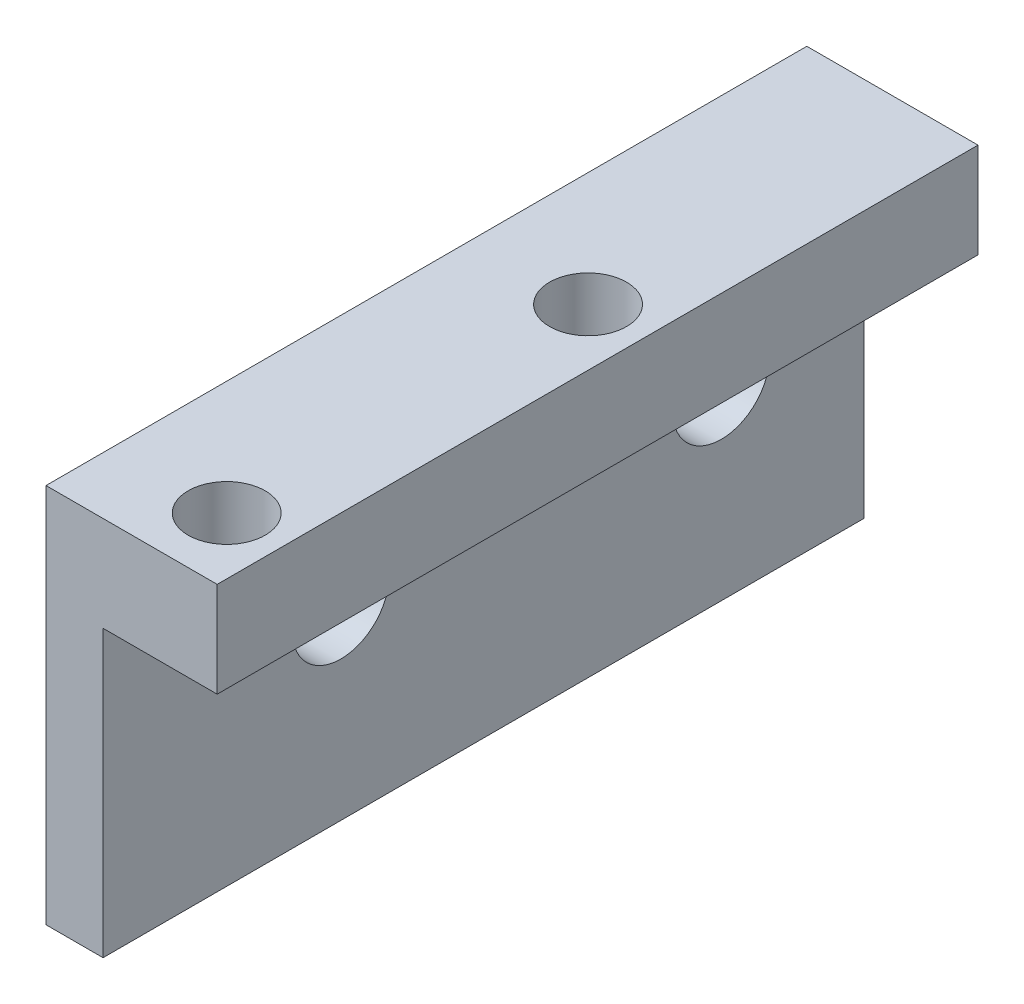
ISO-10303-21;
HEADER;
FILE_DESCRIPTION(('STEP AP214'),'2;1');
FILE_NAME('part.step','',(''),(''),'','','');
FILE_SCHEMA(('AUTOMOTIVE_DESIGN { 1 0 10303 214 1 1 1 1 }'));
ENDSEC;
DATA;
#1=APPLICATION_CONTEXT('core data for automotive mechanical design processes');
#2=APPLICATION_PROTOCOL_DEFINITION('international standard','automotive_design',2000,#1);
#3=PRODUCT_CONTEXT('',#1,'mechanical');
#4=PRODUCT('Part','Part','',(#3));
#5=PRODUCT_RELATED_PRODUCT_CATEGORY('part','',(#4));
#6=PRODUCT_DEFINITION_FORMATION('','',#4);
#7=PRODUCT_DEFINITION_CONTEXT('part definition',#1,'design');
#8=PRODUCT_DEFINITION('design','',#6,#7);
#9=PRODUCT_DEFINITION_SHAPE('','',#8);
#10=(LENGTH_UNIT() NAMED_UNIT(*) SI_UNIT(.MILLI.,.METRE.));
#11=(NAMED_UNIT(*) PLANE_ANGLE_UNIT() SI_UNIT($,.RADIAN.));
#12=(NAMED_UNIT(*) SI_UNIT($,.STERADIAN.) SOLID_ANGLE_UNIT());
#13=UNCERTAINTY_MEASURE_WITH_UNIT(LENGTH_MEASURE(1.E-05),#10,'distance_accuracy_value','');
#14=(GEOMETRIC_REPRESENTATION_CONTEXT(3) GLOBAL_UNCERTAINTY_ASSIGNED_CONTEXT((#13)) GLOBAL_UNIT_ASSIGNED_CONTEXT((#10,
#11,#12)) REPRESENTATION_CONTEXT('',''));
#15=CARTESIAN_POINT('',(0.,0.,0.));
#16=DIRECTION('',(0.,0.,1.));
#17=DIRECTION('',(1.,0.,0.));
#18=AXIS2_PLACEMENT_3D('',#15,#16,#17);
#19=CARTESIAN_POINT('',(0.,-5.,0.));
#20=DIRECTION('',(-1.,0.,0.));
#21=DIRECTION('',(0.,0.,1.));
#22=AXIS2_PLACEMENT_3D('',#19,#20,#21);
#23=PLANE('',#22);
#24=CARTESIAN_POINT('',(0.,-10.1,-32.5));
#25=DIRECTION('',(1.,0.,0.));
#26=DIRECTION('',(0.,0.,-1.));
#27=AXIS2_PLACEMENT_3D('',#24,#25,#26);
#28=CIRCLE('',#27,2.55);
#29=CARTESIAN_POINT('',(0.,-10.1,-35.05));
#30=VERTEX_POINT('',#29);
#31=EDGE_CURVE('E176',#30,#30,#28,.T.);
#32=ORIENTED_EDGE('',*,*,#31,.T.);
#33=EDGE_LOOP('',(#32));
#34=FACE_BOUND('',#33,.T.);
#35=CARTESIAN_POINT('',(0.,-10.1,-12.5));
#36=DIRECTION('',(1.,0.,0.));
#37=DIRECTION('',(0.,0.,-1.));
#38=AXIS2_PLACEMENT_3D('',#35,#36,#37);
#39=CIRCLE('',#38,2.55);
#40=CARTESIAN_POINT('',(0.,-10.1,-15.05));
#41=VERTEX_POINT('',#40);
#42=EDGE_CURVE('E129',#41,#41,#39,.T.);
#43=ORIENTED_EDGE('',*,*,#42,.T.);
#44=EDGE_LOOP('',(#43));
#45=FACE_BOUND('',#44,.T.);
#46=DIRECTION('',(0.,0.,1.));
#47=VECTOR('',#46,1.);
#48=CARTESIAN_POINT('',(0.,0.,0.));
#49=LINE('',#48,#47);
#50=CARTESIAN_POINT('',(0.,0.,-40.));
#51=VERTEX_POINT('',#50);
#52=CARTESIAN_POINT('',(0.,0.,0.));
#53=VERTEX_POINT('',#52);
#54=EDGE_CURVE('E85',#51,#53,#49,.T.);
#55=ORIENTED_EDGE('',*,*,#54,.F.);
#56=DIRECTION('',(0.,1.,0.));
#57=VECTOR('',#56,1.);
#58=CARTESIAN_POINT('',(0.,-5.,-40.));
#59=LINE('',#58,#57);
#60=CARTESIAN_POINT('',(0.,-20.,-40.));
#61=VERTEX_POINT('',#60);
#62=EDGE_CURVE('E11',#61,#51,#59,.T.);
#63=ORIENTED_EDGE('',*,*,#62,.F.);
#64=DIRECTION('',(0.,0.,-1.));
#65=VECTOR('',#64,1.);
#66=CARTESIAN_POINT('',(0.,-20.,0.));
#67=LINE('',#66,#65);
#68=CARTESIAN_POINT('',(0.,-20.,0.));
#69=VERTEX_POINT('',#68);
#70=EDGE_CURVE('E121',#69,#61,#67,.T.);
#71=ORIENTED_EDGE('',*,*,#70,.F.);
#72=DIRECTION('',(0.,1.,0.));
#73=VECTOR('',#72,1.);
#74=CARTESIAN_POINT('',(0.,-5.,0.));
#75=LINE('',#74,#73);
#76=EDGE_CURVE('E36',#69,#53,#75,.T.);
#77=ORIENTED_EDGE('',*,*,#76,.T.);
#78=EDGE_LOOP('',(#55,#63,#71,#77));
#79=FACE_BOUND('',#78,.T.);
#80=ADVANCED_FACE('F33',(#34,#45,#79),#23,.T.);
#81=CARTESIAN_POINT('',(0.,-5.,-40.));
#82=DIRECTION('',(0.,0.,-1.));
#83=DIRECTION('',(-1.,0.,0.));
#84=AXIS2_PLACEMENT_3D('',#81,#82,#83);
#85=PLANE('',#84);
#86=DIRECTION('',(-1.,0.,0.));
#87=VECTOR('',#86,1.);
#88=CARTESIAN_POINT('',(0.,0.,-40.));
#89=LINE('',#88,#87);
#90=CARTESIAN_POINT('',(9.,0.,-40.));
#91=VERTEX_POINT('',#90);
#92=EDGE_CURVE('E76',#91,#51,#89,.T.);
#93=ORIENTED_EDGE('',*,*,#92,.F.);
#94=DIRECTION('',(0.,1.,0.));
#95=VECTOR('',#94,1.);
#96=CARTESIAN_POINT('',(9.,-5.,-40.));
#97=LINE('',#96,#95);
#98=CARTESIAN_POINT('',(9.,-5.,-40.));
#99=VERTEX_POINT('',#98);
#100=EDGE_CURVE('E41',#99,#91,#97,.T.);
#101=ORIENTED_EDGE('',*,*,#100,.F.);
#102=DIRECTION('',(-1.,0.,0.));
#103=VECTOR('',#102,1.);
#104=CARTESIAN_POINT('',(0.,-5.,-40.));
#105=LINE('',#104,#103);
#106=CARTESIAN_POINT('',(3.,-5.,-40.));
#107=VERTEX_POINT('',#106);
#108=EDGE_CURVE('E107',#99,#107,#105,.T.);
#109=ORIENTED_EDGE('',*,*,#108,.T.);
#110=DIRECTION('',(0.,1.,0.));
#111=VECTOR('',#110,1.);
#112=CARTESIAN_POINT('',(3.00000000000001,-20.,-40.));
#113=LINE('',#112,#111);
#114=CARTESIAN_POINT('',(3.00000000000001,-20.,-40.));
#115=VERTEX_POINT('',#114);
#116=EDGE_CURVE('E137',#115,#107,#113,.T.);
#117=ORIENTED_EDGE('',*,*,#116,.F.);
#118=DIRECTION('',(1.,0.,0.));
#119=VECTOR('',#118,1.);
#120=CARTESIAN_POINT('',(0.,-20.,-40.));
#121=LINE('',#120,#119);
#122=EDGE_CURVE('E80',#61,#115,#121,.T.);
#123=ORIENTED_EDGE('',*,*,#122,.F.);
#124=ORIENTED_EDGE('',*,*,#62,.T.);
#125=EDGE_LOOP('',(#93,#101,#109,#117,#123,#124));
#126=FACE_BOUND('',#125,.T.);
#127=ADVANCED_FACE('F74',(#126),#85,.T.);
#128=CARTESIAN_POINT('',(9.,-5.,0.));
#129=DIRECTION('',(1.,0.,0.));
#130=DIRECTION('',(0.,0.,-1.));
#131=AXIS2_PLACEMENT_3D('',#128,#129,#130);
#132=PLANE('',#131);
#133=DIRECTION('',(0.,0.,-1.));
#134=VECTOR('',#133,1.);
#135=CARTESIAN_POINT('',(9.,0.,0.));
#136=LINE('',#135,#134);
#137=CARTESIAN_POINT('',(9.,0.,0.));
#138=VERTEX_POINT('',#137);
#139=EDGE_CURVE('E96',#138,#91,#136,.T.);
#140=ORIENTED_EDGE('',*,*,#139,.F.);
#141=DIRECTION('',(0.,1.,0.));
#142=VECTOR('',#141,1.);
#143=CARTESIAN_POINT('',(9.,-5.,0.));
#144=LINE('',#143,#142);
#145=CARTESIAN_POINT('',(9.,-5.,0.));
#146=VERTEX_POINT('',#145);
#147=EDGE_CURVE('E104',#146,#138,#144,.T.);
#148=ORIENTED_EDGE('',*,*,#147,.F.);
#149=DIRECTION('',(0.,0.,-1.));
#150=VECTOR('',#149,1.);
#151=CARTESIAN_POINT('',(9.,-5.,0.));
#152=LINE('',#151,#150);
#153=EDGE_CURVE('E99',#146,#99,#152,.T.);
#154=ORIENTED_EDGE('',*,*,#153,.T.);
#155=ORIENTED_EDGE('',*,*,#100,.T.);
#156=EDGE_LOOP('',(#140,#148,#154,#155));
#157=FACE_BOUND('',#156,.T.);
#158=ADVANCED_FACE('F172',(#157),#132,.T.);
#159=CARTESIAN_POINT('',(0.,-5.,0.));
#160=DIRECTION('',(0.,0.,1.));
#161=DIRECTION('',(1.,0.,0.));
#162=AXIS2_PLACEMENT_3D('',#159,#160,#161);
#163=PLANE('',#162);
#164=DIRECTION('',(1.,0.,0.));
#165=VECTOR('',#164,1.);
#166=CARTESIAN_POINT('',(0.,0.,0.));
#167=LINE('',#166,#165);
#168=EDGE_CURVE('E90',#53,#138,#167,.T.);
#169=ORIENTED_EDGE('',*,*,#168,.F.);
#170=ORIENTED_EDGE('',*,*,#76,.F.);
#171=DIRECTION('',(-1.,0.,0.));
#172=VECTOR('',#171,1.);
#173=CARTESIAN_POINT('',(0.,-20.,0.));
#174=LINE('',#173,#172);
#175=CARTESIAN_POINT('',(3.,-20.,0.));
#176=VERTEX_POINT('',#175);
#177=EDGE_CURVE('E116',#176,#69,#174,.T.);
#178=ORIENTED_EDGE('',*,*,#177,.F.);
#179=DIRECTION('',(0.,1.,0.));
#180=VECTOR('',#179,1.);
#181=CARTESIAN_POINT('',(3.,-20.,0.));
#182=LINE('',#181,#180);
#183=CARTESIAN_POINT('',(3.,-5.,0.));
#184=VERTEX_POINT('',#183);
#185=EDGE_CURVE('E125',#176,#184,#182,.T.);
#186=ORIENTED_EDGE('',*,*,#185,.T.);
#187=DIRECTION('',(1.,0.,0.));
#188=VECTOR('',#187,1.);
#189=CARTESIAN_POINT('',(0.,-5.,0.));
#190=LINE('',#189,#188);
#191=EDGE_CURVE('E97',#184,#146,#190,.T.);
#192=ORIENTED_EDGE('',*,*,#191,.T.);
#193=ORIENTED_EDGE('',*,*,#147,.T.);
#194=EDGE_LOOP('',(#169,#170,#178,#186,#192,#193));
#195=FACE_BOUND('',#194,.T.);
#196=ADVANCED_FACE('F111',(#195),#163,.T.);
#197=CARTESIAN_POINT('',(0.,-5.,0.));
#198=DIRECTION('',(0.,-1.,0.));
#199=DIRECTION('',(0.,0.,-1.));
#200=AXIS2_PLACEMENT_3D('',#197,#198,#199);
#201=PLANE('',#200);
#202=DIRECTION('',(0.,0.,1.));
#203=VECTOR('',#202,1.);
#204=CARTESIAN_POINT('',(3.,-5.,0.));
#205=LINE('',#204,#203);
#206=EDGE_CURVE('E49',#107,#184,#205,.T.);
#207=ORIENTED_EDGE('',*,*,#206,.F.);
#208=ORIENTED_EDGE('',*,*,#108,.F.);
#209=ORIENTED_EDGE('',*,*,#153,.F.);
#210=ORIENTED_EDGE('',*,*,#191,.F.);
#211=EDGE_LOOP('',(#207,#208,#209,#210));
#212=FACE_BOUND('',#211,.T.);
#213=CARTESIAN_POINT('',(6.,-5.,-22.4993568689714));
#214=DIRECTION('',(0.,1.,0.));
#215=DIRECTION('',(0.,0.,1.));
#216=AXIS2_PLACEMENT_3D('',#213,#214,#215);
#217=CIRCLE('',#216,2.025);
#218=CARTESIAN_POINT('',(6.,-5.,-20.4743568689714));
#219=VERTEX_POINT('',#218);
#220=EDGE_CURVE('E140',#219,#219,#217,.T.);
#221=ORIENTED_EDGE('',*,*,#220,.T.);
#222=EDGE_LOOP('',(#221));
#223=FACE_BOUND('',#222,.T.);
#224=CARTESIAN_POINT('',(6.,-5.,-3.4993568689714));
#225=DIRECTION('',(0.,1.,0.));
#226=DIRECTION('',(0.,0.,1.));
#227=AXIS2_PLACEMENT_3D('',#224,#225,#226);
#228=CIRCLE('',#227,2.025);
#229=CARTESIAN_POINT('',(6.,-5.,-1.4743568689714));
#230=VERTEX_POINT('',#229);
#231=EDGE_CURVE('E91',#230,#230,#228,.T.);
#232=ORIENTED_EDGE('',*,*,#231,.T.);
#233=EDGE_LOOP('',(#232));
#234=FACE_BOUND('',#233,.T.);
#235=ADVANCED_FACE('F154',(#212,#223,#234),#201,.T.);
#236=CARTESIAN_POINT('',(0.,0.,0.));
#237=DIRECTION('',(0.,-1.,0.));
#238=DIRECTION('',(0.,0.,-1.));
#239=AXIS2_PLACEMENT_3D('',#236,#237,#238);
#240=PLANE('',#239);
#241=CARTESIAN_POINT('',(6.,0.,-22.4993568689714));
#242=DIRECTION('',(0.,1.,0.));
#243=DIRECTION('',(0.,0.,1.));
#244=AXIS2_PLACEMENT_3D('',#241,#242,#243);
#245=CIRCLE('',#244,2.025);
#246=CARTESIAN_POINT('',(6.,0.,-20.4743568689714));
#247=VERTEX_POINT('',#246);
#248=EDGE_CURVE('E139',#247,#247,#245,.T.);
#249=ORIENTED_EDGE('',*,*,#248,.F.);
#250=EDGE_LOOP('',(#249));
#251=FACE_BOUND('',#250,.T.);
#252=CARTESIAN_POINT('',(6.,0.,-3.4993568689714));
#253=DIRECTION('',(0.,1.,0.));
#254=DIRECTION('',(0.,0.,1.));
#255=AXIS2_PLACEMENT_3D('',#252,#253,#254);
#256=CIRCLE('',#255,2.025);
#257=CARTESIAN_POINT('',(6.,0.,-1.4743568689714));
#258=VERTEX_POINT('',#257);
#259=EDGE_CURVE('E143',#258,#258,#256,.T.);
#260=ORIENTED_EDGE('',*,*,#259,.F.);
#261=EDGE_LOOP('',(#260));
#262=FACE_BOUND('',#261,.T.);
#263=ORIENTED_EDGE('',*,*,#54,.T.);
#264=ORIENTED_EDGE('',*,*,#168,.T.);
#265=ORIENTED_EDGE('',*,*,#139,.T.);
#266=ORIENTED_EDGE('',*,*,#92,.T.);
#267=EDGE_LOOP('',(#263,#264,#265,#266));
#268=FACE_BOUND('',#267,.T.);
#269=ADVANCED_FACE('F94',(#251,#262,#268),#240,.F.);
#270=CARTESIAN_POINT('',(6.,-5.,-3.4993568689714));
#271=DIRECTION('',(0.,1.,0.));
#272=DIRECTION('',(0.,0.,1.));
#273=AXIS2_PLACEMENT_3D('',#270,#271,#272);
#274=CYLINDRICAL_SURFACE('',#273,2.025);
#275=ORIENTED_EDGE('',*,*,#231,.F.);
#276=EDGE_LOOP('',(#275));
#277=FACE_BOUND('',#276,.T.);
#278=ORIENTED_EDGE('',*,*,#259,.T.);
#279=EDGE_LOOP('',(#278));
#280=FACE_BOUND('',#279,.T.);
#281=ADVANCED_FACE('F151',(#277,#280),#274,.F.);
#282=CARTESIAN_POINT('',(6.,-5.,-22.4993568689714));
#283=DIRECTION('',(0.,1.,0.));
#284=DIRECTION('',(0.,0.,1.));
#285=AXIS2_PLACEMENT_3D('',#282,#283,#284);
#286=CYLINDRICAL_SURFACE('',#285,2.025);
#287=ORIENTED_EDGE('',*,*,#220,.F.);
#288=EDGE_LOOP('',(#287));
#289=FACE_BOUND('',#288,.T.);
#290=ORIENTED_EDGE('',*,*,#248,.T.);
#291=EDGE_LOOP('',(#290));
#292=FACE_BOUND('',#291,.T.);
#293=ADVANCED_FACE('F161',(#289,#292),#286,.F.);
#294=CARTESIAN_POINT('',(3.,-20.,0.));
#295=DIRECTION('',(-1.,0.,0.));
#296=DIRECTION('',(0.,0.,1.));
#297=AXIS2_PLACEMENT_3D('',#294,#295,#296);
#298=PLANE('',#297);
#299=CARTESIAN_POINT('',(3.,-10.1,-32.5));
#300=DIRECTION('',(1.,0.,0.));
#301=DIRECTION('',(0.,0.,-1.));
#302=AXIS2_PLACEMENT_3D('',#299,#300,#301);
#303=CIRCLE('',#302,2.55);
#304=CARTESIAN_POINT('',(3.,-10.1,-35.05));
#305=VERTEX_POINT('',#304);
#306=EDGE_CURVE('E182',#305,#305,#303,.T.);
#307=ORIENTED_EDGE('',*,*,#306,.F.);
#308=EDGE_LOOP('',(#307));
#309=FACE_BOUND('',#308,.T.);
#310=CARTESIAN_POINT('',(3.,-10.1,-12.5));
#311=DIRECTION('',(1.,0.,0.));
#312=DIRECTION('',(0.,0.,-1.));
#313=AXIS2_PLACEMENT_3D('',#310,#311,#312);
#314=CIRCLE('',#313,2.55);
#315=CARTESIAN_POINT('',(3.,-10.1,-15.05));
#316=VERTEX_POINT('',#315);
#317=EDGE_CURVE('E132',#316,#316,#314,.T.);
#318=ORIENTED_EDGE('',*,*,#317,.F.);
#319=EDGE_LOOP('',(#318));
#320=FACE_BOUND('',#319,.T.);
#321=ORIENTED_EDGE('',*,*,#206,.T.);
#322=ORIENTED_EDGE('',*,*,#185,.F.);
#323=DIRECTION('',(0.,0.,1.));
#324=VECTOR('',#323,1.);
#325=CARTESIAN_POINT('',(3.,-20.,0.));
#326=LINE('',#325,#324);
#327=EDGE_CURVE('E123',#115,#176,#326,.T.);
#328=ORIENTED_EDGE('',*,*,#327,.F.);
#329=ORIENTED_EDGE('',*,*,#116,.T.);
#330=EDGE_LOOP('',(#321,#322,#328,#329));
#331=FACE_BOUND('',#330,.T.);
#332=ADVANCED_FACE('F189',(#309,#320,#331),#298,.F.);
#333=CARTESIAN_POINT('',(0.,-20.,0.));
#334=DIRECTION('',(0.,-1.,0.));
#335=DIRECTION('',(0.,0.,-1.));
#336=AXIS2_PLACEMENT_3D('',#333,#334,#335);
#337=PLANE('',#336);
#338=ORIENTED_EDGE('',*,*,#70,.T.);
#339=ORIENTED_EDGE('',*,*,#122,.T.);
#340=ORIENTED_EDGE('',*,*,#327,.T.);
#341=ORIENTED_EDGE('',*,*,#177,.T.);
#342=EDGE_LOOP('',(#338,#339,#340,#341));
#343=FACE_BOUND('',#342,.T.);
#344=ADVANCED_FACE('F120',(#343),#337,.T.);
#345=CARTESIAN_POINT('',(0.,-10.1,-12.5));
#346=DIRECTION('',(1.,0.,0.));
#347=DIRECTION('',(0.,0.,-1.));
#348=AXIS2_PLACEMENT_3D('',#345,#346,#347);
#349=CYLINDRICAL_SURFACE('',#348,2.55);
#350=ORIENTED_EDGE('',*,*,#42,.F.);
#351=EDGE_LOOP('',(#350));
#352=FACE_BOUND('',#351,.T.);
#353=ORIENTED_EDGE('',*,*,#317,.T.);
#354=EDGE_LOOP('',(#353));
#355=FACE_BOUND('',#354,.T.);
#356=ADVANCED_FACE('F211',(#352,#355),#349,.F.);
#357=CARTESIAN_POINT('',(0.,-10.1,-32.5));
#358=DIRECTION('',(1.,0.,0.));
#359=DIRECTION('',(0.,0.,-1.));
#360=AXIS2_PLACEMENT_3D('',#357,#358,#359);
#361=CYLINDRICAL_SURFACE('',#360,2.55);
#362=ORIENTED_EDGE('',*,*,#31,.F.);
#363=EDGE_LOOP('',(#362));
#364=FACE_BOUND('',#363,.T.);
#365=ORIENTED_EDGE('',*,*,#306,.T.);
#366=EDGE_LOOP('',(#365));
#367=FACE_BOUND('',#366,.T.);
#368=ADVANCED_FACE('F187',(#364,#367),#361,.F.);
#369=CLOSED_SHELL('',(#80,#127,#158,#196,#235,#269,#281,#293,#332,#344,#356,#368));
#370=MANIFOLD_SOLID_BREP('B2',#369);
#371=ADVANCED_BREP_SHAPE_REPRESENTATION('',(#18,#370),#14);
#372=SHAPE_DEFINITION_REPRESENTATION(#9,#371);
ENDSEC;
END-ISO-10303-21;
